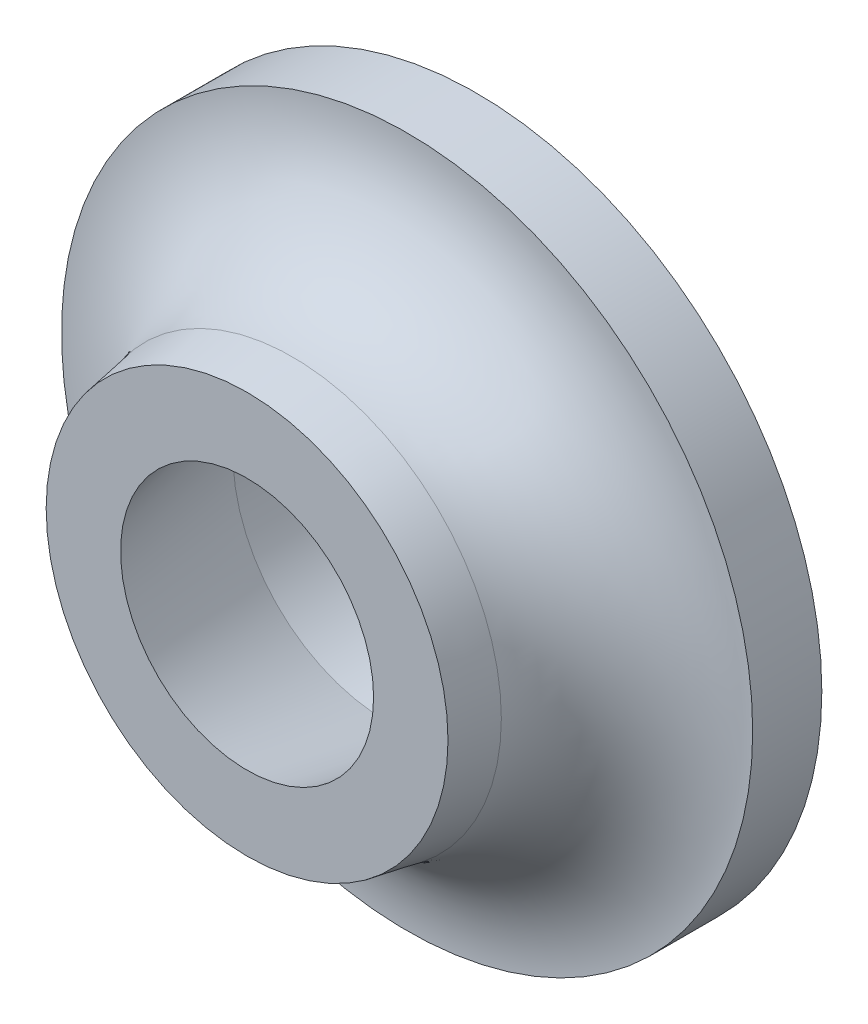
ISO-10303-21;
HEADER;
FILE_DESCRIPTION(('STEP AP214'),'2;1');
FILE_NAME('part.step','',(''),(''),'','','');
FILE_SCHEMA(('AUTOMOTIVE_DESIGN { 1 0 10303 214 1 1 1 1 }'));
ENDSEC;
DATA;
#1=APPLICATION_CONTEXT('core data for automotive mechanical design processes');
#2=APPLICATION_PROTOCOL_DEFINITION('international standard','automotive_design',2000,#1);
#3=PRODUCT_CONTEXT('',#1,'mechanical');
#4=PRODUCT('Part','Part','',(#3));
#5=PRODUCT_RELATED_PRODUCT_CATEGORY('part','',(#4));
#6=PRODUCT_DEFINITION_FORMATION('','',#4);
#7=PRODUCT_DEFINITION_CONTEXT('part definition',#1,'design');
#8=PRODUCT_DEFINITION('design','',#6,#7);
#9=PRODUCT_DEFINITION_SHAPE('','',#8);
#10=(LENGTH_UNIT() NAMED_UNIT(*) SI_UNIT(.MILLI.,.METRE.));
#11=(NAMED_UNIT(*) PLANE_ANGLE_UNIT() SI_UNIT($,.RADIAN.));
#12=(NAMED_UNIT(*) SI_UNIT($,.STERADIAN.) SOLID_ANGLE_UNIT());
#13=UNCERTAINTY_MEASURE_WITH_UNIT(LENGTH_MEASURE(1.E-05),#10,'distance_accuracy_value','');
#14=(GEOMETRIC_REPRESENTATION_CONTEXT(3) GLOBAL_UNCERTAINTY_ASSIGNED_CONTEXT((#13)) GLOBAL_UNIT_ASSIGNED_CONTEXT((#10,
#11,#12)) REPRESENTATION_CONTEXT('',''));
#15=CARTESIAN_POINT('',(0.,0.,0.));
#16=DIRECTION('',(0.,0.,1.));
#17=DIRECTION('',(1.,0.,0.));
#18=AXIS2_PLACEMENT_3D('',#15,#16,#17);
#19=CARTESIAN_POINT('',(0.,0.,-2.04503998201178));
#20=DIRECTION('',(0.,0.,1.));
#21=DIRECTION('',(1.,0.,0.));
#22=AXIS2_PLACEMENT_3D('',#19,#20,#21);
#23=TOROIDAL_SURFACE('',#22,25.,10.0395995547428);
#24=CARTESIAN_POINT('',(0.,0.,-3.7883981491986));
#25=DIRECTION('',(0.,0.,1.));
#26=DIRECTION('',(1.,0.,0.));
#27=AXIS2_PLACEMENT_3D('',#24,#25,#26);
#28=CIRCLE('',#27,15.1129245213514);
#29=CARTESIAN_POINT('',(15.1129245213514,0.,-3.7883981491986));
#30=VERTEX_POINT('',#29);
#31=EDGE_CURVE('E10',#30,#30,#28,.T.);
#32=ORIENTED_EDGE('',*,*,#31,.F.);
#33=EDGE_LOOP('',(#32));
#34=FACE_BOUND('',#33,.T.);
#35=CARTESIAN_POINT('',(0.,0.,-12.0846395367546));
#36=DIRECTION('',(0.,0.,1.));
#37=DIRECTION('',(1.,0.,0.));
#38=AXIS2_PLACEMENT_3D('',#35,#36,#37);
#39=CIRCLE('',#38,25.);
#40=CARTESIAN_POINT('',(25.,0.,-12.0846395367546));
#41=VERTEX_POINT('',#40);
#42=EDGE_CURVE('E58',#41,#41,#39,.T.);
#43=ORIENTED_EDGE('',*,*,#42,.T.);
#44=EDGE_LOOP('',(#43));
#45=FACE_BOUND('',#44,.T.);
#46=ADVANCED_FACE('F33',(#34,#45),#23,.F.);
#47=CARTESIAN_POINT('',(0.,0.,-3.7883981491986));
#48=DIRECTION('',(0.,0.,-1.));
#49=DIRECTION('',(-1.,0.,0.));
#50=AXIS2_PLACEMENT_3D('',#47,#48,#49);
#51=CONICAL_SURFACE('',#50,15.1129245213514,0.174532925199434);
#52=CARTESIAN_POINT('',(0.,0.,-0.507957169240569));
#53=DIRECTION('',(0.,0.,1.));
#54=DIRECTION('',(1.,0.,0.));
#55=AXIS2_PLACEMENT_3D('',#52,#53,#54);
#56=CIRCLE('',#55,14.5344942679631);
#57=CARTESIAN_POINT('',(14.5344942679631,0.,-0.507957169240569));
#58=VERTEX_POINT('',#57);
#59=EDGE_CURVE('E39',#58,#58,#56,.T.);
#60=ORIENTED_EDGE('',*,*,#59,.F.);
#61=EDGE_LOOP('',(#60));
#62=FACE_BOUND('',#61,.T.);
#63=ORIENTED_EDGE('',*,*,#31,.T.);
#64=EDGE_LOOP('',(#63));
#65=FACE_BOUND('',#64,.T.);
#66=ADVANCED_FACE('F89',(#62,#65),#51,.T.);
#67=CARTESIAN_POINT('',(0.,9.15132860068431,-0.507957169240568));
#68=DIRECTION('',(0.,0.,-1.));
#69=DIRECTION('',(-1.,0.,0.));
#70=AXIS2_PLACEMENT_3D('',#67,#68,#69);
#71=PLANE('',#70);
#72=CARTESIAN_POINT('',(0.,0.,-0.507957169240569));
#73=DIRECTION('',(0.,0.,1.));
#74=DIRECTION('',(1.,0.,0.));
#75=AXIS2_PLACEMENT_3D('',#72,#73,#74);
#76=CIRCLE('',#75,9.15132860068431);
#77=CARTESIAN_POINT('',(9.15132860068431,0.,-0.507957169240569));
#78=VERTEX_POINT('',#77);
#79=EDGE_CURVE('E43',#78,#78,#76,.T.);
#80=ORIENTED_EDGE('',*,*,#79,.F.);
#81=EDGE_LOOP('',(#80));
#82=FACE_BOUND('',#81,.T.);
#83=ORIENTED_EDGE('',*,*,#59,.T.);
#84=EDGE_LOOP('',(#83));
#85=FACE_BOUND('',#84,.T.);
#86=ADVANCED_FACE('F84',(#82,#85),#71,.F.);
#87=CARTESIAN_POINT('',(0.,0.,-0.507957169240569));
#88=DIRECTION('',(0.,0.,-1.));
#89=DIRECTION('',(-1.,0.,0.));
#90=AXIS2_PLACEMENT_3D('',#87,#88,#89);
#91=CONICAL_SURFACE('',#90,9.15132860068431,0.191026219231218);
#92=CARTESIAN_POINT('',(0.,0.,-10.5846395367546));
#93=DIRECTION('',(0.,0.,1.));
#94=DIRECTION('',(1.,0.,0.));
#95=AXIS2_PLACEMENT_3D('',#92,#93,#94);
#96=CIRCLE('',#95,11.1);
#97=CARTESIAN_POINT('',(11.1,0.,-10.5846395367546));
#98=VERTEX_POINT('',#97);
#99=EDGE_CURVE('E47',#98,#98,#96,.T.);
#100=ORIENTED_EDGE('',*,*,#99,.F.);
#101=EDGE_LOOP('',(#100));
#102=FACE_BOUND('',#101,.T.);
#103=ORIENTED_EDGE('',*,*,#79,.T.);
#104=EDGE_LOOP('',(#103));
#105=FACE_BOUND('',#104,.T.);
#106=ADVANCED_FACE('F78',(#102,#105),#91,.F.);
#107=CARTESIAN_POINT('',(0.,0.,51.4954979569622));
#108=DIRECTION('',(0.,0.,1.));
#109=DIRECTION('',(1.,0.,0.));
#110=AXIS2_PLACEMENT_3D('',#107,#108,#109);
#111=CYLINDRICAL_SURFACE('',#110,11.1);
#112=CARTESIAN_POINT('',(0.,0.,-17.0846395367546));
#113=DIRECTION('',(0.,0.,1.));
#114=DIRECTION('',(1.,0.,0.));
#115=AXIS2_PLACEMENT_3D('',#112,#113,#114);
#116=CIRCLE('',#115,11.1);
#117=CARTESIAN_POINT('',(11.1,0.,-17.0846395367546));
#118=VERTEX_POINT('',#117);
#119=EDGE_CURVE('E52',#118,#118,#116,.T.);
#120=ORIENTED_EDGE('',*,*,#119,.F.);
#121=EDGE_LOOP('',(#120));
#122=FACE_BOUND('',#121,.T.);
#123=ORIENTED_EDGE('',*,*,#99,.T.);
#124=EDGE_LOOP('',(#123));
#125=FACE_BOUND('',#124,.T.);
#126=ADVANCED_FACE('F72',(#122,#125),#111,.F.);
#127=CARTESIAN_POINT('',(0.,11.1,-17.0846395367546));
#128=DIRECTION('',(0.,0.,1.));
#129=DIRECTION('',(1.,0.,0.));
#130=AXIS2_PLACEMENT_3D('',#127,#128,#129);
#131=PLANE('',#130);
#132=CARTESIAN_POINT('',(0.,0.,-17.0846395367546));
#133=DIRECTION('',(0.,0.,1.));
#134=DIRECTION('',(1.,0.,0.));
#135=AXIS2_PLACEMENT_3D('',#132,#133,#134);
#136=CIRCLE('',#135,25.);
#137=CARTESIAN_POINT('',(25.,0.,-17.0846395367546));
#138=VERTEX_POINT('',#137);
#139=EDGE_CURVE('E55',#138,#138,#136,.T.);
#140=ORIENTED_EDGE('',*,*,#139,.F.);
#141=EDGE_LOOP('',(#140));
#142=FACE_BOUND('',#141,.T.);
#143=ORIENTED_EDGE('',*,*,#119,.T.);
#144=EDGE_LOOP('',(#143));
#145=FACE_BOUND('',#144,.T.);
#146=ADVANCED_FACE('F66',(#142,#145),#131,.F.);
#147=CARTESIAN_POINT('',(0.,0.,51.4954979569622));
#148=DIRECTION('',(0.,0.,1.));
#149=DIRECTION('',(1.,0.,0.));
#150=AXIS2_PLACEMENT_3D('',#147,#148,#149);
#151=CYLINDRICAL_SURFACE('',#150,25.);
#152=ORIENTED_EDGE('',*,*,#42,.F.);
#153=EDGE_LOOP('',(#152));
#154=FACE_BOUND('',#153,.T.);
#155=ORIENTED_EDGE('',*,*,#139,.T.);
#156=EDGE_LOOP('',(#155));
#157=FACE_BOUND('',#156,.T.);
#158=ADVANCED_FACE('F63',(#154,#157),#151,.T.);
#159=CLOSED_SHELL('',(#46,#66,#86,#106,#126,#146,#158));
#160=MANIFOLD_SOLID_BREP('B2',#159);
#161=ADVANCED_BREP_SHAPE_REPRESENTATION('',(#18,#160),#14);
#162=SHAPE_DEFINITION_REPRESENTATION(#9,#161);
ENDSEC;
END-ISO-10303-21;
